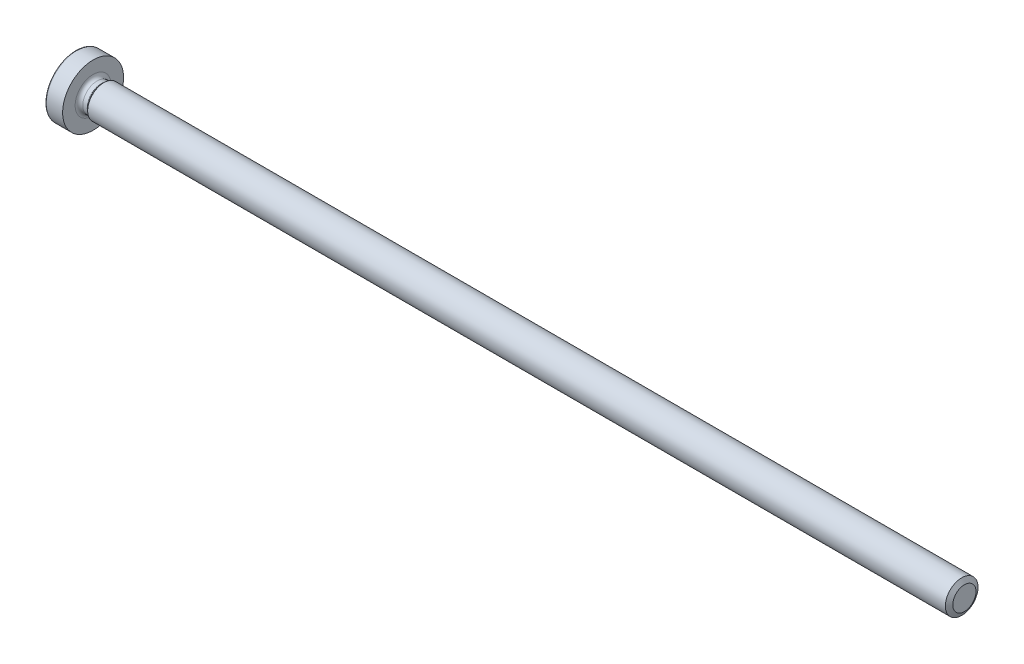
ISO-10303-21;
HEADER;
FILE_DESCRIPTION(('STEP AP214'),'2;1');
FILE_NAME('part.step','',(''),(''),'','','');
FILE_SCHEMA(('AUTOMOTIVE_DESIGN { 1 0 10303 214 1 1 1 1 }'));
ENDSEC;
DATA;
#1=APPLICATION_CONTEXT('core data for automotive mechanical design processes');
#2=APPLICATION_PROTOCOL_DEFINITION('international standard','automotive_design',2000,#1);
#3=PRODUCT_CONTEXT('',#1,'mechanical');
#4=PRODUCT('Part','Part','',(#3));
#5=PRODUCT_RELATED_PRODUCT_CATEGORY('part','',(#4));
#6=PRODUCT_DEFINITION_FORMATION('','',#4);
#7=PRODUCT_DEFINITION_CONTEXT('part definition',#1,'design');
#8=PRODUCT_DEFINITION('design','',#6,#7);
#9=PRODUCT_DEFINITION_SHAPE('','',#8);
#10=(LENGTH_UNIT() NAMED_UNIT(*) SI_UNIT(.MILLI.,.METRE.));
#11=(NAMED_UNIT(*) PLANE_ANGLE_UNIT() SI_UNIT($,.RADIAN.));
#12=(NAMED_UNIT(*) SI_UNIT($,.STERADIAN.) SOLID_ANGLE_UNIT());
#13=UNCERTAINTY_MEASURE_WITH_UNIT(LENGTH_MEASURE(1.E-05),#10,'distance_accuracy_value','');
#14=(GEOMETRIC_REPRESENTATION_CONTEXT(3) GLOBAL_UNCERTAINTY_ASSIGNED_CONTEXT((#13)) GLOBAL_UNIT_ASSIGNED_CONTEXT((#10,
#11,#12)) REPRESENTATION_CONTEXT('',''));
#15=CARTESIAN_POINT('',(0.,0.,0.));
#16=DIRECTION('',(0.,0.,1.));
#17=DIRECTION('',(1.,0.,0.));
#18=AXIS2_PLACEMENT_3D('',#15,#16,#17);
#19=CARTESIAN_POINT('',(-3.44200137834921,0.,0.));
#20=DIRECTION('',(-1.,0.,0.));
#21=DIRECTION('',(0.,0.,1.));
#22=AXIS2_PLACEMENT_3D('',#19,#20,#21);
#23=CYLINDRICAL_SURFACE('',#22,1.5);
#24=CARTESIAN_POINT('',(3.4,0.,0.));
#25=DIRECTION('',(-1.,0.,0.));
#26=DIRECTION('',(0.,0.,1.));
#27=AXIS2_PLACEMENT_3D('',#24,#25,#26);
#28=CIRCLE('',#27,1.49999999999999);
#29=CARTESIAN_POINT('',(3.4,0.,1.49999999999999));
#30=VERTEX_POINT('',#29);
#31=EDGE_CURVE('E928',#30,#30,#28,.T.);
#32=ORIENTED_EDGE('',*,*,#31,.F.);
#33=EDGE_LOOP('',(#32));
#34=FACE_BOUND('',#33,.T.);
#35=CARTESIAN_POINT('',(82.1527080028721,0.,0.));
#36=DIRECTION('',(-1.,0.,0.));
#37=DIRECTION('',(0.,0.,1.));
#38=AXIS2_PLACEMENT_3D('',#35,#36,#37);
#39=CIRCLE('',#38,1.49999999999999);
#40=CARTESIAN_POINT('',(82.1527080028721,0.,1.49999999999999));
#41=VERTEX_POINT('',#40);
#42=EDGE_CURVE('E923',#41,#41,#39,.T.);
#43=ORIENTED_EDGE('',*,*,#42,.T.);
#44=EDGE_LOOP('',(#43));
#45=FACE_BOUND('',#44,.T.);
#46=ADVANCED_FACE('F153',(#34,#45),#23,.T.);
#47=CARTESIAN_POINT('',(5.,0.,0.));
#48=DIRECTION('',(-1.,0.,0.));
#49=DIRECTION('',(0.,1.,0.));
#50=AXIS2_PLACEMENT_3D('',#47,#48,#49);
#51=SPHERICAL_SURFACE('',#50,5.);
#52=CARTESIAN_POINT('',(4.60651618361134,-0.55805322393577,0.55805322393577));
#53=DIRECTION('',(-0.446197814505031,-0.63281415531376,0.63281415531376));
#54=DIRECTION('',(0.,-0.707106781186548,-0.707106781186547));
#55=AXIS2_PLACEMENT_3D('',#52,#53,#54);
#56=CIRCLE('',#55,4.92161799459791);
#57=CARTESIAN_POINT('',(0.212229293358308,1.22830113216143,-0.754007950458524));
#58=VERTEX_POINT('',#57);
#59=CARTESIAN_POINT('',(0.212229293358308,0.754007950458524,-1.22830113216143));
#60=VERTEX_POINT('',#59);
#61=EDGE_CURVE('E406',#58,#60,#56,.T.);
#62=ORIENTED_EDGE('',*,*,#61,.F.);
#63=CARTESIAN_POINT('',(4.99447111284247,-0.0450291723721166,-0.0434841662986057));
#64=DIRECTION('',(0.0879813128153512,0.71655029075622,0.691964572368025));
#65=DIRECTION('',(0.,-0.694658370458996,0.719339800338652));
#66=AXIS2_PLACEMENT_3D('',#63,#64,#65);
#67=CIRCLE('',#66,4.99960507763599);
#68=CARTESIAN_POINT('',(0.0743133377131069,0.80531583195465,-0.298458231192016));
#69=VERTEX_POINT('',#68);
#70=EDGE_CURVE('E13',#58,#69,#67,.T.);
#71=ORIENTED_EDGE('',*,*,#70,.T.);
#72=CARTESIAN_POINT('',(5.00907871968526,0.0739402382392261,0.0283829982019892));
#73=DIRECTION('',(0.113883497498907,0.927506656060473,0.356036447517578));
#74=DIRECTION('',(0.,-0.358367949545299,0.933580426497202));
#75=AXIS2_PLACEMENT_3D('',#72,#73,#74);
#76=CIRCLE('',#75,4.9993644419497);
#77=CARTESIAN_POINT('',(0.0483882559325494,0.693931650822548,0.));
#78=VERTEX_POINT('',#77);
#79=EDGE_CURVE('E163',#69,#78,#76,.T.);
#80=ORIENTED_EDGE('',*,*,#79,.T.);
#81=CARTESIAN_POINT('',(5.00907871968526,0.0739402382392261,-0.0283829982019892));
#82=DIRECTION('',(0.113883497498907,0.927506656060473,-0.356036447517578));
#83=DIRECTION('',(0.,0.358367949545299,0.933580426497202));
#84=AXIS2_PLACEMENT_3D('',#81,#82,#83);
#85=CIRCLE('',#84,4.9993644419497);
#86=CARTESIAN_POINT('',(0.0743133377131423,0.805315831954646,0.298458231192016));
#87=VERTEX_POINT('',#86);
#88=EDGE_CURVE('E277',#78,#87,#85,.T.);
#89=ORIENTED_EDGE('',*,*,#88,.T.);
#90=CARTESIAN_POINT('',(4.99447111284247,-0.0450291723721168,0.0434841662986059));
#91=DIRECTION('',(0.0879813128153512,0.71655029075622,-0.691964572368025));
#92=DIRECTION('',(0.,0.694658370458996,0.719339800338652));
#93=AXIS2_PLACEMENT_3D('',#90,#91,#92);
#94=CIRCLE('',#93,4.99960507763599);
#95=CARTESIAN_POINT('',(0.212229293358308,1.22830113216143,0.754007950458524));
#96=VERTEX_POINT('',#95);
#97=EDGE_CURVE('E416',#87,#96,#94,.T.);
#98=ORIENTED_EDGE('',*,*,#97,.T.);
#99=CARTESIAN_POINT('',(4.60651618361134,-0.55805322393577,-0.55805322393577));
#100=DIRECTION('',(-0.446197814505031,-0.63281415531376,-0.63281415531376));
#101=DIRECTION('',(0.,0.707106781186548,-0.707106781186547));
#102=AXIS2_PLACEMENT_3D('',#99,#100,#101);
#103=CIRCLE('',#102,4.92161799459791);
#104=CARTESIAN_POINT('',(0.212229294438488,0.754007950138531,1.22830113171979));
#105=VERTEX_POINT('',#104);
#106=EDGE_CURVE('E848',#105,#96,#103,.T.);
#107=ORIENTED_EDGE('',*,*,#106,.F.);
#108=CARTESIAN_POINT('',(4.99447111284247,0.0434841662986051,-0.0450291723721159));
#109=DIRECTION('',(0.0879813128153509,-0.691964572368025,0.71655029075622));
#110=DIRECTION('',(0.,-0.719339800338652,-0.694658370458996));
#111=AXIS2_PLACEMENT_3D('',#108,#109,#110);
#112=CIRCLE('',#111,4.99960507763599);
#113=CARTESIAN_POINT('',(0.0743133377131064,0.298458231192016,0.80531583195465));
#114=VERTEX_POINT('',#113);
#115=EDGE_CURVE('E843',#105,#114,#112,.T.);
#116=ORIENTED_EDGE('',*,*,#115,.T.);
#117=CARTESIAN_POINT('',(5.00907871968526,-0.0283829982019896,0.0739402382392272));
#118=DIRECTION('',(0.113883497498906,-0.356036447517578,0.927506656060473));
#119=DIRECTION('',(0.,-0.933580426497202,-0.358367949545299));
#120=AXIS2_PLACEMENT_3D('',#117,#118,#119);
#121=CIRCLE('',#120,4.9993644419497);
#122=CARTESIAN_POINT('',(0.0483882559325497,0.,0.693931650822548));
#123=VERTEX_POINT('',#122);
#124=EDGE_CURVE('E839',#114,#123,#121,.T.);
#125=ORIENTED_EDGE('',*,*,#124,.T.);
#126=CARTESIAN_POINT('',(5.00907871968526,0.0283829982019897,0.0739402382392272));
#127=DIRECTION('',(0.113883497498906,0.356036447517578,0.927506656060473));
#128=DIRECTION('',(0.,-0.933580426497202,0.3583679495453));
#129=AXIS2_PLACEMENT_3D('',#126,#127,#128);
#130=CIRCLE('',#129,4.9993644419497);
#131=CARTESIAN_POINT('',(0.074313337713142,-0.298458231192016,0.805315831954646));
#132=VERTEX_POINT('',#131);
#133=EDGE_CURVE('E835',#123,#132,#130,.T.);
#134=ORIENTED_EDGE('',*,*,#133,.T.);
#135=CARTESIAN_POINT('',(4.99447111284247,-0.043484166298605,-0.0450291723721158));
#136=DIRECTION('',(0.0879813128153509,0.691964572368025,0.71655029075622));
#137=DIRECTION('',(0.,-0.719339800338652,0.694658370458997));
#138=AXIS2_PLACEMENT_3D('',#135,#136,#137);
#139=CIRCLE('',#138,4.99960507763599);
#140=CARTESIAN_POINT('',(0.212229293358308,-0.754007950458524,1.22830113216143));
#141=VERTEX_POINT('',#140);
#142=EDGE_CURVE('E831',#132,#141,#139,.T.);
#143=ORIENTED_EDGE('',*,*,#142,.T.);
#144=CARTESIAN_POINT('',(4.60651618361134,0.55805322393577,-0.55805322393577));
#145=DIRECTION('',(-0.446197814505031,0.632814155313759,-0.63281415531376));
#146=DIRECTION('',(0.,0.707106781186548,0.707106781186547));
#147=AXIS2_PLACEMENT_3D('',#144,#145,#146);
#148=CIRCLE('',#147,4.92161799459791);
#149=CARTESIAN_POINT('',(0.212229294438488,-1.22830113171979,0.754007950138532));
#150=VERTEX_POINT('',#149);
#151=EDGE_CURVE('E827',#150,#141,#148,.T.);
#152=ORIENTED_EDGE('',*,*,#151,.F.);
#153=CARTESIAN_POINT('',(4.99447111284247,0.0450291723721165,0.0434841662986056));
#154=DIRECTION('',(0.0879813128153512,-0.71655029075622,-0.691964572368025));
#155=DIRECTION('',(0.,0.694658370458996,-0.719339800338653));
#156=AXIS2_PLACEMENT_3D('',#153,#154,#155);
#157=CIRCLE('',#156,4.99960507763599);
#158=CARTESIAN_POINT('',(0.0743133377131069,-0.80531583195465,0.298458231192016));
#159=VERTEX_POINT('',#158);
#160=EDGE_CURVE('E822',#150,#159,#157,.T.);
#161=ORIENTED_EDGE('',*,*,#160,.T.);
#162=CARTESIAN_POINT('',(5.00907871968526,-0.0739402382392262,-0.0283829982019892));
#163=DIRECTION('',(0.113883497498907,-0.927506656060473,-0.356036447517577));
#164=DIRECTION('',(0.,0.358367949545299,-0.933580426497202));
#165=AXIS2_PLACEMENT_3D('',#162,#163,#164);
#166=CIRCLE('',#165,4.9993644419497);
#167=CARTESIAN_POINT('',(0.0483882559325494,-0.693931650822548,0.));
#168=VERTEX_POINT('',#167);
#169=EDGE_CURVE('E817',#159,#168,#166,.T.);
#170=ORIENTED_EDGE('',*,*,#169,.T.);
#171=CARTESIAN_POINT('',(5.00907871968526,-0.0739402382392262,0.0283829982019892));
#172=DIRECTION('',(0.113883497498907,-0.927506656060473,0.356036447517578));
#173=DIRECTION('',(0.,-0.358367949545299,-0.933580426497202));
#174=AXIS2_PLACEMENT_3D('',#171,#172,#173);
#175=CIRCLE('',#174,4.9993644419497);
#176=CARTESIAN_POINT('',(0.0743133377131423,-0.805315831954646,-0.298458231192016));
#177=VERTEX_POINT('',#176);
#178=EDGE_CURVE('E812',#168,#177,#175,.T.);
#179=ORIENTED_EDGE('',*,*,#178,.T.);
#180=CARTESIAN_POINT('',(4.99447111284247,0.0450291723721165,-0.0434841662986056));
#181=DIRECTION('',(0.0879813128153511,-0.71655029075622,0.691964572368025));
#182=DIRECTION('',(0.,-0.694658370458996,-0.719339800338652));
#183=AXIS2_PLACEMENT_3D('',#180,#181,#182);
#184=CIRCLE('',#183,4.99960507763599);
#185=CARTESIAN_POINT('',(0.212229293358308,-1.22830113216143,-0.754007950458525));
#186=VERTEX_POINT('',#185);
#187=EDGE_CURVE('E807',#177,#186,#184,.T.);
#188=ORIENTED_EDGE('',*,*,#187,.T.);
#189=CARTESIAN_POINT('',(4.60651618361134,0.55805322393577,0.55805322393577));
#190=DIRECTION('',(-0.446197814505031,0.632814155313759,0.63281415531376));
#191=DIRECTION('',(0.,-0.707106781186548,0.707106781186547));
#192=AXIS2_PLACEMENT_3D('',#189,#190,#191);
#193=CIRCLE('',#192,4.92161799459791);
#194=CARTESIAN_POINT('',(0.212229294438488,-0.754007950138531,-1.22830113171979));
#195=VERTEX_POINT('',#194);
#196=EDGE_CURVE('E803',#195,#186,#193,.T.);
#197=ORIENTED_EDGE('',*,*,#196,.F.);
#198=CARTESIAN_POINT('',(4.99447111284247,-0.0434841662986053,0.0450291723721161));
#199=DIRECTION('',(0.0879813128153509,0.691964572368025,-0.71655029075622));
#200=DIRECTION('',(0.,0.719339800338652,0.694658370458997));
#201=AXIS2_PLACEMENT_3D('',#198,#199,#200);
#202=CIRCLE('',#201,4.99960507763599);
#203=CARTESIAN_POINT('',(0.0743133377131064,-0.298458231192016,-0.80531583195465));
#204=VERTEX_POINT('',#203);
#205=EDGE_CURVE('E799',#195,#204,#202,.T.);
#206=ORIENTED_EDGE('',*,*,#205,.T.);
#207=CARTESIAN_POINT('',(5.00907871968526,0.0283829982019897,-0.0739402382392272));
#208=DIRECTION('',(0.113883497498906,0.356036447517578,-0.927506656060473));
#209=DIRECTION('',(0.,0.933580426497202,0.3583679495453));
#210=AXIS2_PLACEMENT_3D('',#207,#208,#209);
#211=CIRCLE('',#210,4.9993644419497);
#212=CARTESIAN_POINT('',(0.0483882559325497,0.,-0.693931650822548));
#213=VERTEX_POINT('',#212);
#214=EDGE_CURVE('E795',#204,#213,#211,.T.);
#215=ORIENTED_EDGE('',*,*,#214,.T.);
#216=CARTESIAN_POINT('',(5.00907871968526,-0.0283829982019896,-0.0739402382392272));
#217=DIRECTION('',(0.113883497498906,-0.356036447517578,-0.927506656060473));
#218=DIRECTION('',(0.,0.933580426497202,-0.358367949545299));
#219=AXIS2_PLACEMENT_3D('',#216,#217,#218);
#220=CIRCLE('',#219,4.9993644419497);
#221=CARTESIAN_POINT('',(0.0743133377131421,0.298458231192016,-0.805315831954646));
#222=VERTEX_POINT('',#221);
#223=EDGE_CURVE('E791',#213,#222,#220,.T.);
#224=ORIENTED_EDGE('',*,*,#223,.T.);
#225=CARTESIAN_POINT('',(4.99447111284247,0.0434841662986051,0.045029172372116));
#226=DIRECTION('',(0.0879813128153509,-0.691964572368025,-0.71655029075622));
#227=DIRECTION('',(0.,0.719339800338652,-0.694658370458996));
#228=AXIS2_PLACEMENT_3D('',#225,#226,#227);
#229=CIRCLE('',#228,4.99960507763599);
#230=EDGE_CURVE('E413',#222,#60,#229,.T.);
#231=ORIENTED_EDGE('',*,*,#230,.T.);
#232=EDGE_LOOP('',(#62,#71,#80,#89,#98,#107,#116,#125,#134,#143,#152,#161,#170,#179,#188,#197,
#206,#215,#224,#231));
#233=FACE_BOUND('',#232,.T.);
#234=CARTESIAN_POINT('',(0.827541163212067,0.,0.));
#235=DIRECTION('',(1.,0.,0.));
#236=DIRECTION('',(0.,0.,-1.));
#237=AXIS2_PLACEMENT_3D('',#234,#235,#236);
#238=CIRCLE('',#237,2.75510204081633);
#239=CARTESIAN_POINT('',(0.827541163212067,0.,-2.75510204081633));
#240=VERTEX_POINT('',#239);
#241=EDGE_CURVE('E775',#240,#240,#238,.F.);
#242=ORIENTED_EDGE('',*,*,#241,.T.);
#243=EDGE_LOOP('',(#242));
#244=FACE_BOUND('',#243,.T.);
#245=ADVANCED_FACE('F410',(#233,#244),#51,.T.);
#246=CARTESIAN_POINT('',(-3.44200137834921,0.,0.));
#247=DIRECTION('',(-1.,0.,0.));
#248=DIRECTION('',(0.,0.,1.));
#249=AXIS2_PLACEMENT_3D('',#246,#247,#248);
#250=CYLINDRICAL_SURFACE('',#249,2.8);
#251=CARTESIAN_POINT('',(0.910990339947826,0.,0.));
#252=DIRECTION('',(1.,0.,0.));
#253=DIRECTION('',(0.,0.,-1.));
#254=AXIS2_PLACEMENT_3D('',#251,#252,#253);
#255=CIRCLE('',#254,2.8);
#256=CARTESIAN_POINT('',(0.910990339947826,0.,-2.8));
#257=VERTEX_POINT('',#256);
#258=EDGE_CURVE('E772',#257,#257,#255,.T.);
#259=ORIENTED_EDGE('',*,*,#258,.T.);
#260=EDGE_LOOP('',(#259));
#261=FACE_BOUND('',#260,.T.);
#262=CARTESIAN_POINT('',(2.4,0.,0.));
#263=DIRECTION('',(-1.,0.,0.));
#264=DIRECTION('',(0.,0.,1.));
#265=AXIS2_PLACEMENT_3D('',#262,#263,#264);
#266=CIRCLE('',#265,2.8);
#267=CARTESIAN_POINT('',(2.4,0.,2.8));
#268=VERTEX_POINT('',#267);
#269=EDGE_CURVE('E933',#268,#268,#266,.T.);
#270=ORIENTED_EDGE('',*,*,#269,.T.);
#271=EDGE_LOOP('',(#270));
#272=FACE_BOUND('',#271,.T.);
#273=ADVANCED_FACE('F739',(#261,#272),#250,.T.);
#274=CARTESIAN_POINT('',(2.4,2.8,0.));
#275=DIRECTION('',(-1.,0.,0.));
#276=DIRECTION('',(0.,0.,1.));
#277=AXIS2_PLACEMENT_3D('',#274,#275,#276);
#278=PLANE('',#277);
#279=CARTESIAN_POINT('',(2.4,0.,0.));
#280=DIRECTION('',(-1.,0.,0.));
#281=DIRECTION('',(0.,0.,1.));
#282=AXIS2_PLACEMENT_3D('',#279,#280,#281);
#283=CIRCLE('',#282,1.65);
#284=CARTESIAN_POINT('',(2.4,0.,1.65));
#285=VERTEX_POINT('',#284);
#286=EDGE_CURVE('E781',#285,#285,#283,.T.);
#287=ORIENTED_EDGE('',*,*,#286,.T.);
#288=EDGE_LOOP('',(#287));
#289=FACE_BOUND('',#288,.T.);
#290=ORIENTED_EDGE('',*,*,#269,.F.);
#291=EDGE_LOOP('',(#290));
#292=FACE_BOUND('',#291,.T.);
#293=ADVANCED_FACE('F752',(#289,#292),#278,.F.);
#294=CARTESIAN_POINT('',(-3.44200137834921,0.,0.));
#295=DIRECTION('',(-1.,0.,0.));
#296=DIRECTION('',(0.,0.,1.));
#297=AXIS2_PLACEMENT_3D('',#294,#295,#296);
#298=CYLINDRICAL_SURFACE('',#297,1.299);
#299=CARTESIAN_POINT('',(3.1575786437627,0.,0.));
#300=DIRECTION('',(-1.,0.,0.));
#301=DIRECTION('',(0.,0.,1.));
#302=AXIS2_PLACEMENT_3D('',#299,#300,#301);
#303=CIRCLE('',#302,1.299);
#304=CARTESIAN_POINT('',(3.1575786437627,0.,1.299));
#305=VERTEX_POINT('',#304);
#306=EDGE_CURVE('E778',#305,#305,#303,.T.);
#307=ORIENTED_EDGE('',*,*,#306,.T.);
#308=EDGE_LOOP('',(#307));
#309=FACE_BOUND('',#308,.T.);
#310=CARTESIAN_POINT('',(2.751,0.,0.));
#311=DIRECTION('',(-1.,0.,0.));
#312=DIRECTION('',(0.,0.,1.));
#313=AXIS2_PLACEMENT_3D('',#310,#311,#312);
#314=CIRCLE('',#313,1.299);
#315=CARTESIAN_POINT('',(2.751,0.,1.299));
#316=VERTEX_POINT('',#315);
#317=EDGE_CURVE('E776',#316,#316,#314,.F.);
#318=ORIENTED_EDGE('',*,*,#317,.T.);
#319=EDGE_LOOP('',(#318));
#320=FACE_BOUND('',#319,.T.);
#321=ADVANCED_FACE('F748',(#309,#320),#298,.T.);
#322=CARTESIAN_POINT('',(3.4,0.,0.));
#323=DIRECTION('',(1.,0.,0.));
#324=DIRECTION('',(0.,0.,-1.));
#325=AXIS2_PLACEMENT_3D('',#322,#323,#324);
#326=CONICAL_SURFACE('',#325,1.49999999999999,0.785398163397442);
#327=CARTESIAN_POINT('',(3.22828932188135,0.,0.));
#328=DIRECTION('',(1.,0.,0.));
#329=DIRECTION('',(0.,0.,-1.));
#330=AXIS2_PLACEMENT_3D('',#327,#328,#329);
#331=CIRCLE('',#330,1.32828932188134);
#332=CARTESIAN_POINT('',(3.22828932188135,0.,-1.32828932188134));
#333=VERTEX_POINT('',#332);
#334=EDGE_CURVE('E787',#333,#333,#331,.T.);
#335=ORIENTED_EDGE('',*,*,#334,.T.);
#336=EDGE_LOOP('',(#335));
#337=FACE_BOUND('',#336,.T.);
#338=ORIENTED_EDGE('',*,*,#31,.T.);
#339=EDGE_LOOP('',(#338));
#340=FACE_BOUND('',#339,.T.);
#341=ADVANCED_FACE('F744',(#337,#340),#326,.T.);
#342=CARTESIAN_POINT('',(2.751,0.,0.));
#343=DIRECTION('',(-1.,0.,0.));
#344=DIRECTION('',(0.,0.,1.));
#345=AXIS2_PLACEMENT_3D('',#342,#343,#344);
#346=TOROIDAL_SURFACE('',#345,1.65,0.351);
#347=ORIENTED_EDGE('',*,*,#317,.F.);
#348=EDGE_LOOP('',(#347));
#349=FACE_BOUND('',#348,.T.);
#350=ORIENTED_EDGE('',*,*,#286,.F.);
#351=EDGE_LOOP('',(#350));
#352=FACE_BOUND('',#351,.T.);
#353=ADVANCED_FACE('F747',(#349,#352),#346,.F.);
#354=CARTESIAN_POINT('',(0.910990339947826,0.,0.));
#355=DIRECTION('',(1.,0.,0.));
#356=DIRECTION('',(0.,0.,-1.));
#357=AXIS2_PLACEMENT_3D('',#354,#355,#356);
#358=TOROIDAL_SURFACE('',#357,2.7,0.1);
#359=ORIENTED_EDGE('',*,*,#258,.F.);
#360=EDGE_LOOP('',(#359));
#361=FACE_BOUND('',#360,.T.);
#362=ORIENTED_EDGE('',*,*,#241,.F.);
#363=EDGE_LOOP('',(#362));
#364=FACE_BOUND('',#363,.T.);
#365=ADVANCED_FACE('F761',(#361,#364),#358,.T.);
#366=CARTESIAN_POINT('',(3.1575786437627,0.,0.));
#367=DIRECTION('',(-1.,0.,0.));
#368=DIRECTION('',(0.,0.,1.));
#369=AXIS2_PLACEMENT_3D('',#366,#367,#368);
#370=TOROIDAL_SURFACE('',#369,1.399,0.1);
#371=ORIENTED_EDGE('',*,*,#334,.F.);
#372=EDGE_LOOP('',(#371));
#373=FACE_BOUND('',#372,.T.);
#374=ORIENTED_EDGE('',*,*,#306,.F.);
#375=EDGE_LOOP('',(#374));
#376=FACE_BOUND('',#375,.T.);
#377=ADVANCED_FACE('F155',(#373,#376),#370,.F.);
#378=CARTESIAN_POINT('',(82.1527080028721,0.,0.));
#379=DIRECTION('',(-1.,0.,0.));
#380=DIRECTION('',(0.,0.,1.));
#381=AXIS2_PLACEMENT_3D('',#378,#379,#380);
#382=CONICAL_SURFACE('',#381,1.49999999999999,1.05188801855286);
#383=CARTESIAN_POINT('',(82.4,0.,0.));
#384=DIRECTION('',(-1.,0.,0.));
#385=DIRECTION('',(0.,0.,1.));
#386=AXIS2_PLACEMENT_3D('',#383,#384,#385);
#387=CIRCLE('',#386,1.067);
#388=CARTESIAN_POINT('',(82.4,0.,1.067));
#389=VERTEX_POINT('',#388);
#390=EDGE_CURVE('E921',#389,#389,#387,.T.);
#391=ORIENTED_EDGE('',*,*,#390,.T.);
#392=EDGE_LOOP('',(#391));
#393=FACE_BOUND('',#392,.T.);
#394=ORIENTED_EDGE('',*,*,#42,.F.);
#395=EDGE_LOOP('',(#394));
#396=FACE_BOUND('',#395,.T.);
#397=ADVANCED_FACE('F585',(#393,#396),#382,.T.);
#398=CARTESIAN_POINT('',(82.4,0.,0.));
#399=DIRECTION('',(-1.,0.,0.));
#400=DIRECTION('',(0.,0.,1.));
#401=AXIS2_PLACEMENT_3D('',#398,#399,#400);
#402=PLANE('',#401);
#403=ORIENTED_EDGE('',*,*,#390,.F.);
#404=EDGE_LOOP('',(#403));
#405=FACE_BOUND('',#404,.T.);
#406=ADVANCED_FACE('F337',(#405),#402,.F.);
#407=CARTESIAN_POINT('',(0.,1.31507331423074,-0.816878828796847));
#408=DIRECTION('',(0.0879813128153512,0.71655029075622,0.691964572368025));
#409=DIRECTION('',(0.,-0.694658370458996,0.719339800338652));
#410=AXIS2_PLACEMENT_3D('',#407,#408,#409);
#411=PLANE('',#410);
#412=DIRECTION('',(-0.892670261136446,0.364977639050131,-0.264444942995667));
#413=VECTOR('',#412,1.);
#414=CARTESIAN_POINT('',(0.875,0.957320347572821,-0.557668529994431));
#415=LINE('',#414,#413);
#416=CARTESIAN_POINT('',(1.75,0.5995673809149,-0.298458231192016));
#417=VERTEX_POINT('',#416);
#418=EDGE_CURVE('E280',#417,#58,#415,.T.);
#419=ORIENTED_EDGE('',*,*,#418,.F.);
#420=DIRECTION('',(0.992546151641322,-0.121869343405147,0.));
#421=VECTOR('',#420,1.);
#422=CARTESIAN_POINT('',(0.875,0.707003871704942,-0.298458231192016));
#423=LINE('',#422,#421);
#424=EDGE_CURVE('E297',#69,#417,#423,.T.);
#425=ORIENTED_EDGE('',*,*,#424,.F.);
#426=ORIENTED_EDGE('',*,*,#70,.F.);
#427=EDGE_LOOP('',(#419,#425,#426));
#428=FACE_BOUND('',#427,.T.);
#429=ADVANCED_FACE('F328',(#428),#411,.F.);
#430=CARTESIAN_POINT('',(0.,0.699872981580083,0.));
#431=DIRECTION('',(0.113883497498907,0.927506656060473,0.356036447517578));
#432=DIRECTION('',(0.,-0.358367949545299,0.933580426497202));
#433=AXIS2_PLACEMENT_3D('',#430,#431,#432);
#434=PLANE('',#433);
#435=ORIENTED_EDGE('',*,*,#424,.T.);
#436=DIRECTION('',(0.,-0.3583679495453,0.933580426497202));
#437=VECTOR('',#436,1.);
#438=CARTESIAN_POINT('',(1.75,0.485,0.));
#439=LINE('',#438,#437);
#440=CARTESIAN_POINT('',(1.75,0.485,0.));
#441=VERTEX_POINT('',#440);
#442=EDGE_CURVE('E289',#417,#441,#439,.T.);
#443=ORIENTED_EDGE('',*,*,#442,.T.);
#444=DIRECTION('',(0.992546151641322,-0.121869343405148,0.));
#445=VECTOR('',#444,1.);
#446=CARTESIAN_POINT('',(0.,0.699872981580083,0.));
#447=LINE('',#446,#445);
#448=EDGE_CURVE('E269',#78,#441,#447,.T.);
#449=ORIENTED_EDGE('',*,*,#448,.F.);
#450=ORIENTED_EDGE('',*,*,#79,.F.);
#451=EDGE_LOOP('',(#435,#443,#449,#450));
#452=FACE_BOUND('',#451,.T.);
#453=ADVANCED_FACE('F296',(#452),#434,.F.);
#454=CARTESIAN_POINT('',(1.75,0.5995673809149,-0.298458231192016));
#455=DIRECTION('',(-0.446197814505031,-0.63281415531376,0.63281415531376));
#456=DIRECTION('',(0.,-0.707106781186548,-0.707106781186547));
#457=AXIS2_PLACEMENT_3D('',#454,#455,#456);
#458=PLANE('',#457);
#459=ORIENTED_EDGE('',*,*,#61,.T.);
#460=DIRECTION('',(0.892670261136446,-0.264444942995667,0.364977639050131));
#461=VECTOR('',#460,1.);
#462=CARTESIAN_POINT('',(0.875,0.557668529994431,-0.957320347572821));
#463=LINE('',#462,#461);
#464=CARTESIAN_POINT('',(1.75,0.298458231192015,-0.5995673809149));
#465=VERTEX_POINT('',#464);
#466=EDGE_CURVE('E171',#60,#465,#463,.T.);
#467=ORIENTED_EDGE('',*,*,#466,.T.);
#468=DIRECTION('',(0.,0.707106781186548,0.707106781186547));
#469=VECTOR('',#468,1.);
#470=CARTESIAN_POINT('',(1.75,0.5995673809149,-0.298458231192016));
#471=LINE('',#470,#469);
#472=EDGE_CURVE('E300',#465,#417,#471,.T.);
#473=ORIENTED_EDGE('',*,*,#472,.T.);
#474=ORIENTED_EDGE('',*,*,#418,.T.);
#475=EDGE_LOOP('',(#459,#467,#473,#474));
#476=FACE_BOUND('',#475,.T.);
#477=ADVANCED_FACE('F342',(#476),#458,.T.);
#478=CARTESIAN_POINT('',(0.,0.699872981580083,0.));
#479=DIRECTION('',(0.113883497498907,0.927506656060473,-0.356036447517578));
#480=DIRECTION('',(0.,0.358367949545299,0.933580426497202));
#481=AXIS2_PLACEMENT_3D('',#478,#479,#480);
#482=PLANE('',#481);
#483=ORIENTED_EDGE('',*,*,#448,.T.);
#484=DIRECTION('',(0.,0.3583679495453,0.933580426497202));
#485=VECTOR('',#484,1.);
#486=CARTESIAN_POINT('',(1.75,0.485,0.));
#487=LINE('',#486,#485);
#488=CARTESIAN_POINT('',(1.75,0.5995673809149,0.298458231192016));
#489=VERTEX_POINT('',#488);
#490=EDGE_CURVE('E274',#441,#489,#487,.T.);
#491=ORIENTED_EDGE('',*,*,#490,.T.);
#492=DIRECTION('',(0.992546151641322,-0.121869343405148,0.));
#493=VECTOR('',#492,1.);
#494=CARTESIAN_POINT('',(0.,0.814440362494983,0.298458231192016));
#495=LINE('',#494,#493);
#496=EDGE_CURVE('E281',#87,#489,#495,.T.);
#497=ORIENTED_EDGE('',*,*,#496,.F.);
#498=ORIENTED_EDGE('',*,*,#88,.F.);
#499=EDGE_LOOP('',(#483,#491,#497,#498));
#500=FACE_BOUND('',#499,.T.);
#501=ADVANCED_FACE('F272',(#500),#482,.F.);
#502=CARTESIAN_POINT('',(0.,0.814440362494983,0.298458231192016));
#503=DIRECTION('',(0.0879813128153512,0.71655029075622,-0.691964572368025));
#504=DIRECTION('',(0.,0.694658370458996,0.719339800338652));
#505=AXIS2_PLACEMENT_3D('',#502,#503,#504);
#506=PLANE('',#505);
#507=ORIENTED_EDGE('',*,*,#496,.T.);
#508=DIRECTION('',(0.892670261136446,-0.364977639050131,-0.264444942995667));
#509=VECTOR('',#508,1.);
#510=CARTESIAN_POINT('',(0.875,0.957320347572821,0.557668529994431));
#511=LINE('',#510,#509);
#512=EDGE_CURVE('E537',#96,#489,#511,.T.);
#513=ORIENTED_EDGE('',*,*,#512,.F.);
#514=ORIENTED_EDGE('',*,*,#97,.F.);
#515=EDGE_LOOP('',(#507,#513,#514));
#516=FACE_BOUND('',#515,.T.);
#517=ADVANCED_FACE('F386',(#516),#506,.F.);
#518=CARTESIAN_POINT('',(1.75,0.298458231192016,0.5995673809149));
#519=DIRECTION('',(-0.446197814505031,-0.63281415531376,-0.63281415531376));
#520=DIRECTION('',(0.,0.707106781186548,-0.707106781186547));
#521=AXIS2_PLACEMENT_3D('',#518,#519,#520);
#522=PLANE('',#521);
#523=ORIENTED_EDGE('',*,*,#106,.T.);
#524=ORIENTED_EDGE('',*,*,#512,.T.);
#525=DIRECTION('',(0.,-0.707106781186548,0.707106781186547));
#526=VECTOR('',#525,1.);
#527=CARTESIAN_POINT('',(1.75,0.5995673809149,0.298458231192016));
#528=LINE('',#527,#526);
#529=CARTESIAN_POINT('',(1.75,0.298458231192015,0.5995673809149));
#530=VERTEX_POINT('',#529);
#531=EDGE_CURVE('E293',#489,#530,#528,.T.);
#532=ORIENTED_EDGE('',*,*,#531,.T.);
#533=DIRECTION('',(-0.892670261136446,0.264444942995667,0.364977639050131));
#534=VECTOR('',#533,1.);
#535=CARTESIAN_POINT('',(0.875,0.557668529994431,0.957320347572821));
#536=LINE('',#535,#534);
#537=EDGE_CURVE('E552',#530,#105,#536,.T.);
#538=ORIENTED_EDGE('',*,*,#537,.T.);
#539=EDGE_LOOP('',(#523,#524,#532,#538));
#540=FACE_BOUND('',#539,.T.);
#541=ADVANCED_FACE('F858',(#540),#522,.T.);
#542=CARTESIAN_POINT('',(0.,0.816878828796847,1.31507331423074));
#543=DIRECTION('',(0.0879813128153509,-0.691964572368025,0.71655029075622));
#544=DIRECTION('',(0.,-0.719339800338652,-0.694658370458996));
#545=AXIS2_PLACEMENT_3D('',#542,#543,#544);
#546=PLANE('',#545);
#547=ORIENTED_EDGE('',*,*,#537,.F.);
#548=DIRECTION('',(0.992546151641322,0.,-0.121869343405147));
#549=VECTOR('',#548,1.);
#550=CARTESIAN_POINT('',(0.875,0.298458231192016,0.707003871704942));
#551=LINE('',#550,#549);
#552=EDGE_CURVE('E535',#114,#530,#551,.T.);
#553=ORIENTED_EDGE('',*,*,#552,.F.);
#554=ORIENTED_EDGE('',*,*,#115,.F.);
#555=EDGE_LOOP('',(#547,#553,#554));
#556=FACE_BOUND('',#555,.T.);
#557=ADVANCED_FACE('F862',(#556),#546,.F.);
#558=CARTESIAN_POINT('',(0.,0.,0.699872981580083));
#559=DIRECTION('',(0.113883497498906,-0.356036447517578,0.927506656060473));
#560=DIRECTION('',(0.,-0.933580426497202,-0.358367949545299));
#561=AXIS2_PLACEMENT_3D('',#558,#559,#560);
#562=PLANE('',#561);
#563=ORIENTED_EDGE('',*,*,#552,.T.);
#564=DIRECTION('',(0.,-0.933580426497201,-0.358367949545301));
#565=VECTOR('',#564,1.);
#566=CARTESIAN_POINT('',(1.75,0.,0.485));
#567=LINE('',#566,#565);
#568=CARTESIAN_POINT('',(1.75,0.,0.485));
#569=VERTEX_POINT('',#568);
#570=EDGE_CURVE('E430',#530,#569,#567,.T.);
#571=ORIENTED_EDGE('',*,*,#570,.T.);
#572=DIRECTION('',(0.992546151641322,0.,-0.121869343405147));
#573=VECTOR('',#572,1.);
#574=CARTESIAN_POINT('',(0.,0.,0.699872981580083));
#575=LINE('',#574,#573);
#576=EDGE_CURVE('E157',#123,#569,#575,.T.);
#577=ORIENTED_EDGE('',*,*,#576,.F.);
#578=ORIENTED_EDGE('',*,*,#124,.F.);
#579=EDGE_LOOP('',(#563,#571,#577,#578));
#580=FACE_BOUND('',#579,.T.);
#581=ADVANCED_FACE('F466',(#580),#562,.F.);
#582=CARTESIAN_POINT('',(0.,0.,0.699872981580083));
#583=DIRECTION('',(0.113883497498906,0.356036447517578,0.927506656060473));
#584=DIRECTION('',(0.,-0.933580426497202,0.3583679495453));
#585=AXIS2_PLACEMENT_3D('',#582,#583,#584);
#586=PLANE('',#585);
#587=ORIENTED_EDGE('',*,*,#576,.T.);
#588=DIRECTION('',(0.,-0.933580426497201,0.358367949545301));
#589=VECTOR('',#588,1.);
#590=CARTESIAN_POINT('',(1.75,0.,0.485));
#591=LINE('',#590,#589);
#592=CARTESIAN_POINT('',(1.75,-0.298458231192015,0.5995673809149));
#593=VERTEX_POINT('',#592);
#594=EDGE_CURVE('E427',#569,#593,#591,.T.);
#595=ORIENTED_EDGE('',*,*,#594,.T.);
#596=DIRECTION('',(0.992546151641322,0.,-0.121869343405147));
#597=VECTOR('',#596,1.);
#598=CARTESIAN_POINT('',(0.,-0.298458231192016,0.814440362494983));
#599=LINE('',#598,#597);
#600=EDGE_CURVE('E434',#132,#593,#599,.T.);
#601=ORIENTED_EDGE('',*,*,#600,.F.);
#602=ORIENTED_EDGE('',*,*,#133,.F.);
#603=EDGE_LOOP('',(#587,#595,#601,#602));
#604=FACE_BOUND('',#603,.T.);
#605=ADVANCED_FACE('F455',(#604),#586,.F.);
#606=CARTESIAN_POINT('',(0.,-0.298458231192016,0.814440362494983));
#607=DIRECTION('',(0.0879813128153509,0.691964572368025,0.71655029075622));
#608=DIRECTION('',(0.,-0.719339800338652,0.694658370458997));
#609=AXIS2_PLACEMENT_3D('',#606,#607,#608);
#610=PLANE('',#609);
#611=ORIENTED_EDGE('',*,*,#600,.T.);
#612=DIRECTION('',(0.892670261136446,0.264444942995667,-0.364977639050131));
#613=VECTOR('',#612,1.);
#614=CARTESIAN_POINT('',(0.875,-0.557668529994431,0.957320347572822));
#615=LINE('',#614,#613);
#616=EDGE_CURVE('E437',#141,#593,#615,.T.);
#617=ORIENTED_EDGE('',*,*,#616,.F.);
#618=ORIENTED_EDGE('',*,*,#142,.F.);
#619=EDGE_LOOP('',(#611,#617,#618));
#620=FACE_BOUND('',#619,.T.);
#621=ADVANCED_FACE('F465',(#620),#610,.F.);
#622=CARTESIAN_POINT('',(1.75,-0.5995673809149,0.298458231192016));
#623=DIRECTION('',(-0.446197814505031,0.632814155313759,-0.63281415531376));
#624=DIRECTION('',(0.,0.707106781186548,0.707106781186547));
#625=AXIS2_PLACEMENT_3D('',#622,#623,#624);
#626=PLANE('',#625);
#627=ORIENTED_EDGE('',*,*,#151,.T.);
#628=ORIENTED_EDGE('',*,*,#616,.T.);
#629=DIRECTION('',(0.,-0.707106781186548,-0.707106781186547));
#630=VECTOR('',#629,1.);
#631=CARTESIAN_POINT('',(1.75,-0.5995673809149,0.298458231192016));
#632=LINE('',#631,#630);
#633=CARTESIAN_POINT('',(1.75,-0.5995673809149,0.298458231192016));
#634=VERTEX_POINT('',#633);
#635=EDGE_CURVE('E431',#593,#634,#632,.T.);
#636=ORIENTED_EDGE('',*,*,#635,.T.);
#637=DIRECTION('',(-0.892670261136446,-0.364977639050131,0.264444942995667));
#638=VECTOR('',#637,1.);
#639=CARTESIAN_POINT('',(0.875,-0.957320347572821,0.557668529994432));
#640=LINE('',#639,#638);
#641=EDGE_CURVE('E1184',#634,#150,#640,.T.);
#642=ORIENTED_EDGE('',*,*,#641,.T.);
#643=EDGE_LOOP('',(#627,#628,#636,#642));
#644=FACE_BOUND('',#643,.T.);
#645=ADVANCED_FACE('F473',(#644),#626,.T.);
#646=CARTESIAN_POINT('',(0.,-1.31507331423074,0.816878828796847));
#647=DIRECTION('',(0.0879813128153512,-0.71655029075622,-0.691964572368025));
#648=DIRECTION('',(0.,0.694658370458996,-0.719339800338652));
#649=AXIS2_PLACEMENT_3D('',#646,#647,#648);
#650=PLANE('',#649);
#651=ORIENTED_EDGE('',*,*,#641,.F.);
#652=DIRECTION('',(0.992546151641322,0.121869343405147,0.));
#653=VECTOR('',#652,1.);
#654=CARTESIAN_POINT('',(0.875,-0.707003871704942,0.298458231192016));
#655=LINE('',#654,#653);
#656=EDGE_CURVE('E1187',#159,#634,#655,.T.);
#657=ORIENTED_EDGE('',*,*,#656,.F.);
#658=ORIENTED_EDGE('',*,*,#160,.F.);
#659=EDGE_LOOP('',(#651,#657,#658));
#660=FACE_BOUND('',#659,.T.);
#661=ADVANCED_FACE('F1050',(#660),#650,.F.);
#662=CARTESIAN_POINT('',(0.,-0.699872981580083,0.));
#663=DIRECTION('',(0.113883497498907,-0.927506656060473,-0.356036447517577));
#664=DIRECTION('',(0.,0.358367949545299,-0.933580426497202));
#665=AXIS2_PLACEMENT_3D('',#662,#663,#664);
#666=PLANE('',#665);
#667=ORIENTED_EDGE('',*,*,#656,.T.);
#668=DIRECTION('',(0.,0.358367949545299,-0.933580426497202));
#669=VECTOR('',#668,1.);
#670=CARTESIAN_POINT('',(1.75,-0.485,0.));
#671=LINE('',#670,#669);
#672=CARTESIAN_POINT('',(1.75,-0.485,0.));
#673=VERTEX_POINT('',#672);
#674=EDGE_CURVE('E1190',#634,#673,#671,.T.);
#675=ORIENTED_EDGE('',*,*,#674,.T.);
#676=DIRECTION('',(0.992546151641322,0.121869343405148,0.));
#677=VECTOR('',#676,1.);
#678=CARTESIAN_POINT('',(0.,-0.699872981580083,0.));
#679=LINE('',#678,#677);
#680=EDGE_CURVE('E1151',#168,#673,#679,.T.);
#681=ORIENTED_EDGE('',*,*,#680,.F.);
#682=ORIENTED_EDGE('',*,*,#169,.F.);
#683=EDGE_LOOP('',(#667,#675,#681,#682));
#684=FACE_BOUND('',#683,.T.);
#685=ADVANCED_FACE('F1058',(#684),#666,.F.);
#686=CARTESIAN_POINT('',(0.,-0.699872981580083,0.));
#687=DIRECTION('',(0.113883497498907,-0.927506656060473,0.356036447517578));
#688=DIRECTION('',(0.,-0.358367949545299,-0.933580426497202));
#689=AXIS2_PLACEMENT_3D('',#686,#687,#688);
#690=PLANE('',#689);
#691=ORIENTED_EDGE('',*,*,#680,.T.);
#692=DIRECTION('',(0.,-0.3583679495453,-0.933580426497202));
#693=VECTOR('',#692,1.);
#694=CARTESIAN_POINT('',(1.75,-0.485,0.));
#695=LINE('',#694,#693);
#696=CARTESIAN_POINT('',(1.75,-0.5995673809149,-0.298458231192016));
#697=VERTEX_POINT('',#696);
#698=EDGE_CURVE('E613',#673,#697,#695,.T.);
#699=ORIENTED_EDGE('',*,*,#698,.T.);
#700=DIRECTION('',(0.992546151641322,0.121869343405148,0.));
#701=VECTOR('',#700,1.);
#702=CARTESIAN_POINT('',(0.,-0.814440362494983,-0.298458231192016));
#703=LINE('',#702,#701);
#704=EDGE_CURVE('E1145',#177,#697,#703,.T.);
#705=ORIENTED_EDGE('',*,*,#704,.F.);
#706=ORIENTED_EDGE('',*,*,#178,.F.);
#707=EDGE_LOOP('',(#691,#699,#705,#706));
#708=FACE_BOUND('',#707,.T.);
#709=ADVANCED_FACE('F1067',(#708),#690,.F.);
#710=CARTESIAN_POINT('',(0.,-0.814440362494983,-0.298458231192016));
#711=DIRECTION('',(0.0879813128153511,-0.71655029075622,0.691964572368025));
#712=DIRECTION('',(0.,-0.694658370458996,-0.719339800338652));
#713=AXIS2_PLACEMENT_3D('',#710,#711,#712);
#714=PLANE('',#713);
#715=ORIENTED_EDGE('',*,*,#704,.T.);
#716=DIRECTION('',(0.892670261136446,0.364977639050131,0.264444942995667));
#717=VECTOR('',#716,1.);
#718=CARTESIAN_POINT('',(0.875,-0.957320347572821,-0.557668529994432));
#719=LINE('',#718,#717);
#720=EDGE_CURVE('E626',#186,#697,#719,.T.);
#721=ORIENTED_EDGE('',*,*,#720,.F.);
#722=ORIENTED_EDGE('',*,*,#187,.F.);
#723=EDGE_LOOP('',(#715,#721,#722));
#724=FACE_BOUND('',#723,.T.);
#725=ADVANCED_FACE('F1077',(#724),#714,.F.);
#726=CARTESIAN_POINT('',(1.75,-0.298458231192015,-0.5995673809149));
#727=DIRECTION('',(-0.446197814505031,0.632814155313759,0.63281415531376));
#728=DIRECTION('',(0.,-0.707106781186548,0.707106781186547));
#729=AXIS2_PLACEMENT_3D('',#726,#727,#728);
#730=PLANE('',#729);
#731=ORIENTED_EDGE('',*,*,#196,.T.);
#732=ORIENTED_EDGE('',*,*,#720,.T.);
#733=DIRECTION('',(0.,0.707106781186548,-0.707106781186547));
#734=VECTOR('',#733,1.);
#735=CARTESIAN_POINT('',(1.75,-0.5995673809149,-0.298458231192016));
#736=LINE('',#735,#734);
#737=CARTESIAN_POINT('',(1.75,-0.298458231192015,-0.5995673809149));
#738=VERTEX_POINT('',#737);
#739=EDGE_CURVE('E609',#697,#738,#736,.T.);
#740=ORIENTED_EDGE('',*,*,#739,.T.);
#741=DIRECTION('',(-0.892670261136446,-0.264444942995667,-0.364977639050131));
#742=VECTOR('',#741,1.);
#743=CARTESIAN_POINT('',(0.875,-0.557668529994431,-0.957320347572821));
#744=LINE('',#743,#742);
#745=EDGE_CURVE('E622',#738,#195,#744,.T.);
#746=ORIENTED_EDGE('',*,*,#745,.T.);
#747=EDGE_LOOP('',(#731,#732,#740,#746));
#748=FACE_BOUND('',#747,.T.);
#749=ADVANCED_FACE('F657',(#748),#730,.T.);
#750=CARTESIAN_POINT('',(0.,-0.816878828796847,-1.31507331423074));
#751=DIRECTION('',(0.0879813128153509,0.691964572368025,-0.71655029075622));
#752=DIRECTION('',(0.,0.719339800338652,0.694658370458997));
#753=AXIS2_PLACEMENT_3D('',#750,#751,#752);
#754=PLANE('',#753);
#755=ORIENTED_EDGE('',*,*,#745,.F.);
#756=DIRECTION('',(0.992546151641322,0.,0.121869343405147));
#757=VECTOR('',#756,1.);
#758=CARTESIAN_POINT('',(0.875,-0.298458231192016,-0.707003871704942));
#759=LINE('',#758,#757);
#760=EDGE_CURVE('E615',#204,#738,#759,.T.);
#761=ORIENTED_EDGE('',*,*,#760,.F.);
#762=ORIENTED_EDGE('',*,*,#205,.F.);
#763=EDGE_LOOP('',(#755,#761,#762));
#764=FACE_BOUND('',#763,.T.);
#765=ADVANCED_FACE('F646',(#764),#754,.F.);
#766=CARTESIAN_POINT('',(0.,0.,-0.699872981580083));
#767=DIRECTION('',(0.113883497498906,0.356036447517578,-0.927506656060473));
#768=DIRECTION('',(0.,0.933580426497202,0.3583679495453));
#769=AXIS2_PLACEMENT_3D('',#766,#767,#768);
#770=PLANE('',#769);
#771=ORIENTED_EDGE('',*,*,#760,.T.);
#772=DIRECTION('',(0.,0.933580426497201,0.358367949545301));
#773=VECTOR('',#772,1.);
#774=CARTESIAN_POINT('',(1.75,0.,-0.485));
#775=LINE('',#774,#773);
#776=CARTESIAN_POINT('',(1.75,0.,-0.485));
#777=VERTEX_POINT('',#776);
#778=EDGE_CURVE('E614',#738,#777,#775,.T.);
#779=ORIENTED_EDGE('',*,*,#778,.T.);
#780=DIRECTION('',(0.992546151641322,0.,0.121869343405147));
#781=VECTOR('',#780,1.);
#782=CARTESIAN_POINT('',(0.,0.,-0.699872981580083));
#783=LINE('',#782,#781);
#784=EDGE_CURVE('E627',#213,#777,#783,.T.);
#785=ORIENTED_EDGE('',*,*,#784,.F.);
#786=ORIENTED_EDGE('',*,*,#214,.F.);
#787=EDGE_LOOP('',(#771,#779,#785,#786));
#788=FACE_BOUND('',#787,.T.);
#789=ADVANCED_FACE('F656',(#788),#770,.F.);
#790=CARTESIAN_POINT('',(0.,0.,-0.699872981580083));
#791=DIRECTION('',(0.113883497498906,-0.356036447517578,-0.927506656060473));
#792=DIRECTION('',(0.,0.933580426497202,-0.358367949545299));
#793=AXIS2_PLACEMENT_3D('',#790,#791,#792);
#794=PLANE('',#793);
#795=ORIENTED_EDGE('',*,*,#784,.T.);
#796=DIRECTION('',(0.,0.933580426497201,-0.358367949545301));
#797=VECTOR('',#796,1.);
#798=CARTESIAN_POINT('',(1.75,0.,-0.485));
#799=LINE('',#798,#797);
#800=EDGE_CURVE('E302',#777,#465,#799,.T.);
#801=ORIENTED_EDGE('',*,*,#800,.T.);
#802=DIRECTION('',(0.992546151641322,0.,0.121869343405147));
#803=VECTOR('',#802,1.);
#804=CARTESIAN_POINT('',(0.,0.298458231192016,-0.814440362494983));
#805=LINE('',#804,#803);
#806=EDGE_CURVE('E711',#222,#465,#805,.T.);
#807=ORIENTED_EDGE('',*,*,#806,.F.);
#808=ORIENTED_EDGE('',*,*,#223,.F.);
#809=EDGE_LOOP('',(#795,#801,#807,#808));
#810=FACE_BOUND('',#809,.T.);
#811=ADVANCED_FACE('F720',(#810),#794,.F.);
#812=CARTESIAN_POINT('',(0.,0.298458231192016,-0.814440362494983));
#813=DIRECTION('',(0.0879813128153509,-0.691964572368025,-0.71655029075622));
#814=DIRECTION('',(0.,0.719339800338652,-0.694658370458996));
#815=AXIS2_PLACEMENT_3D('',#812,#813,#814);
#816=PLANE('',#815);
#817=ORIENTED_EDGE('',*,*,#806,.T.);
#818=ORIENTED_EDGE('',*,*,#466,.F.);
#819=ORIENTED_EDGE('',*,*,#230,.F.);
#820=EDGE_LOOP('',(#817,#818,#819));
#821=FACE_BOUND('',#820,.T.);
#822=ADVANCED_FACE('F582',(#821),#816,.F.);
#823=CARTESIAN_POINT('',(1.75,0.584976792220291,-0.260448448136244));
#824=DIRECTION('',(-1.,0.,0.));
#825=DIRECTION('',(0.,0.,1.));
#826=AXIS2_PLACEMENT_3D('',#823,#824,#825);
#827=PLANE('',#826);
#828=ORIENTED_EDGE('',*,*,#442,.F.);
#829=ORIENTED_EDGE('',*,*,#472,.F.);
#830=ORIENTED_EDGE('',*,*,#800,.F.);
#831=ORIENTED_EDGE('',*,*,#778,.F.);
#832=ORIENTED_EDGE('',*,*,#739,.F.);
#833=ORIENTED_EDGE('',*,*,#698,.F.);
#834=ORIENTED_EDGE('',*,*,#674,.F.);
#835=ORIENTED_EDGE('',*,*,#635,.F.);
#836=ORIENTED_EDGE('',*,*,#594,.F.);
#837=ORIENTED_EDGE('',*,*,#570,.F.);
#838=ORIENTED_EDGE('',*,*,#531,.F.);
#839=ORIENTED_EDGE('',*,*,#490,.F.);
#840=EDGE_LOOP('',(#828,#829,#830,#831,#832,#833,#834,#835,#836,#837,#838,#839));
#841=FACE_BOUND('',#840,.T.);
#842=ADVANCED_FACE('F287',(#841),#827,.T.);
#843=CLOSED_SHELL('',(#46,#245,#273,#293,#321,#341,#353,#365,#377,#397,#406,#429,#453,#477,#501,
#517,#541,#557,#581,#605,#621,#645,#661,#685,#709,#725,#749,#765,#789,#811,#822,#842));
#844=MANIFOLD_SOLID_BREP('B2',#843);
#845=ADVANCED_BREP_SHAPE_REPRESENTATION('',(#18,#844),#14);
#846=SHAPE_DEFINITION_REPRESENTATION(#9,#845);
ENDSEC;
END-ISO-10303-21;
